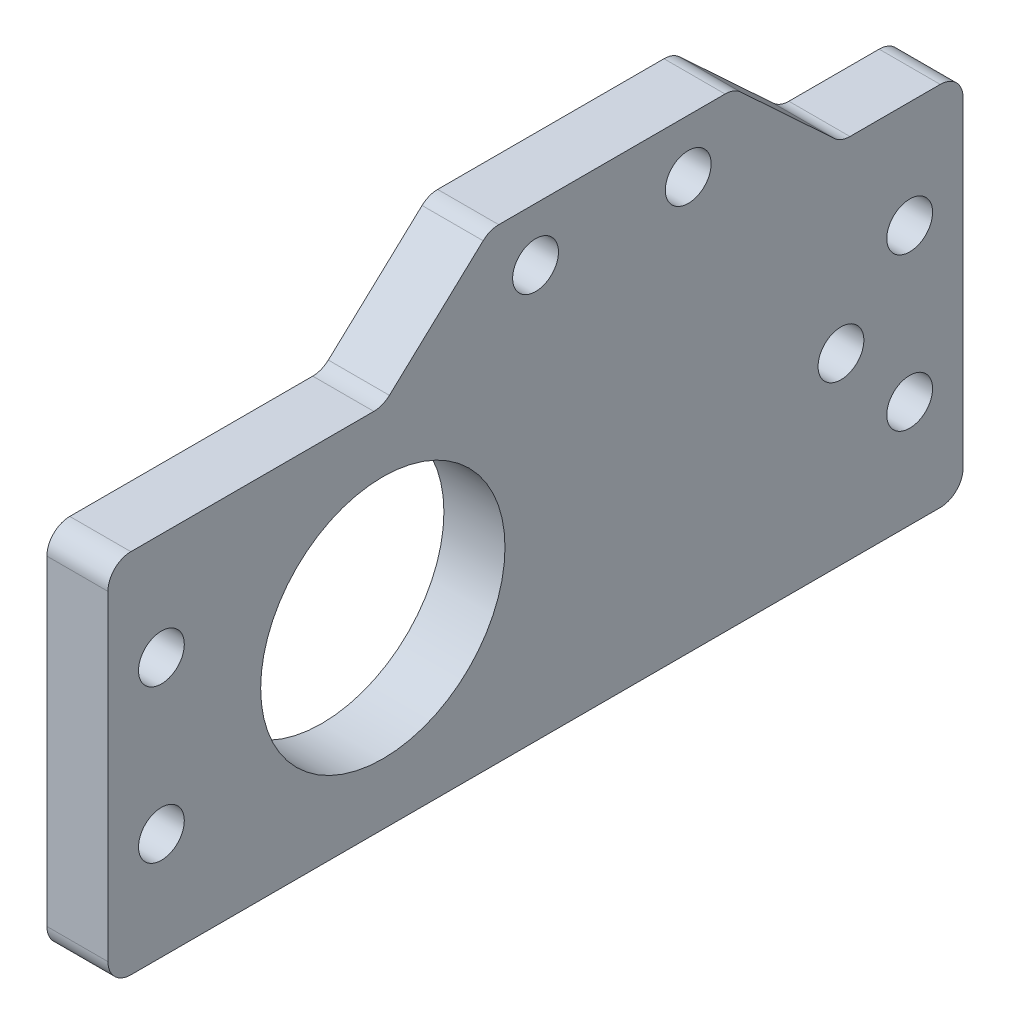
ISO-10303-21;
HEADER;
FILE_DESCRIPTION(('STEP AP214'),'2;1');
FILE_NAME('part.step','',(''),(''),'','','');
FILE_SCHEMA(('AUTOMOTIVE_DESIGN { 1 0 10303 214 1 1 1 1 }'));
ENDSEC;
DATA;
#1=APPLICATION_CONTEXT('core data for automotive mechanical design processes');
#2=APPLICATION_PROTOCOL_DEFINITION('international standard','automotive_design',2000,#1);
#3=PRODUCT_CONTEXT('',#1,'mechanical');
#4=PRODUCT('Part','Part','',(#3));
#5=PRODUCT_RELATED_PRODUCT_CATEGORY('part','',(#4));
#6=PRODUCT_DEFINITION_FORMATION('','',#4);
#7=PRODUCT_DEFINITION_CONTEXT('part definition',#1,'design');
#8=PRODUCT_DEFINITION('design','',#6,#7);
#9=PRODUCT_DEFINITION_SHAPE('','',#8);
#10=(LENGTH_UNIT() NAMED_UNIT(*) SI_UNIT(.MILLI.,.METRE.));
#11=(NAMED_UNIT(*) PLANE_ANGLE_UNIT() SI_UNIT($,.RADIAN.));
#12=(NAMED_UNIT(*) SI_UNIT($,.STERADIAN.) SOLID_ANGLE_UNIT());
#13=UNCERTAINTY_MEASURE_WITH_UNIT(LENGTH_MEASURE(1.E-05),#10,'distance_accuracy_value','');
#14=(GEOMETRIC_REPRESENTATION_CONTEXT(3) GLOBAL_UNCERTAINTY_ASSIGNED_CONTEXT((#13)) GLOBAL_UNIT_ASSIGNED_CONTEXT((#10,
#11,#12)) REPRESENTATION_CONTEXT('',''));
#15=CARTESIAN_POINT('',(0.,0.,0.));
#16=DIRECTION('',(0.,0.,1.));
#17=DIRECTION('',(1.,0.,0.));
#18=AXIS2_PLACEMENT_3D('',#15,#16,#17);
#19=CARTESIAN_POINT('',(4.,13.5,-20.5890353662934));
#20=DIRECTION('',(1.,0.,0.));
#21=DIRECTION('',(0.,0.,-1.));
#22=AXIS2_PLACEMENT_3D('',#19,#20,#21);
#23=PLANE('',#22);
#24=CARTESIAN_POINT('',(4.,-5.,24.5));
#25=DIRECTION('',(1.,0.,0.));
#26=DIRECTION('',(0.,0.,-1.));
#27=AXIS2_PLACEMENT_3D('',#24,#25,#26);
#28=CIRCLE('',#27,1.50000000000001);
#29=CARTESIAN_POINT('',(4.,-5.,23.));
#30=VERTEX_POINT('',#29);
#31=EDGE_CURVE('E363',#30,#30,#28,.T.);
#32=ORIENTED_EDGE('',*,*,#31,.F.);
#33=EDGE_LOOP('',(#32));
#34=FACE_BOUND('',#33,.T.);
#35=CARTESIAN_POINT('',(4.,-5.,-24.5));
#36=DIRECTION('',(1.,0.,0.));
#37=DIRECTION('',(0.,0.,-1.));
#38=AXIS2_PLACEMENT_3D('',#35,#36,#37);
#39=CIRCLE('',#38,1.50000000000001);
#40=CARTESIAN_POINT('',(4.,-5.,-26.));
#41=VERTEX_POINT('',#40);
#42=EDGE_CURVE('E375',#41,#41,#39,.T.);
#43=ORIENTED_EDGE('',*,*,#42,.F.);
#44=EDGE_LOOP('',(#43));
#45=FACE_BOUND('',#44,.T.);
#46=CARTESIAN_POINT('',(4.,0.,10.));
#47=DIRECTION('',(1.,0.,0.));
#48=DIRECTION('',(0.,0.,-1.));
#49=AXIS2_PLACEMENT_3D('',#46,#47,#48);
#50=CIRCLE('',#49,7.99999999999999);
#51=CARTESIAN_POINT('',(4.,0.,2.00000000000001));
#52=VERTEX_POINT('',#51);
#53=EDGE_CURVE('E387',#52,#52,#50,.T.);
#54=ORIENTED_EDGE('',*,*,#53,.F.);
#55=EDGE_LOOP('',(#54));
#56=FACE_BOUND('',#55,.T.);
#57=CARTESIAN_POINT('',(4.,15.,0.));
#58=DIRECTION('',(1.,0.,0.));
#59=DIRECTION('',(0.,0.,-1.));
#60=AXIS2_PLACEMENT_3D('',#57,#58,#59);
#61=CIRCLE('',#60,1.5);
#62=CARTESIAN_POINT('',(4.,15.,-1.5));
#63=VERTEX_POINT('',#62);
#64=EDGE_CURVE('E186',#63,#63,#61,.T.);
#65=ORIENTED_EDGE('',*,*,#64,.F.);
#66=EDGE_LOOP('',(#65));
#67=FACE_BOUND('',#66,.T.);
#68=CARTESIAN_POINT('',(4.,13.5,-20.5890353662934));
#69=DIRECTION('',(-1.,0.,0.));
#70=DIRECTION('',(0.,0.,-1.));
#71=AXIS2_PLACEMENT_3D('',#68,#69,#70);
#72=CIRCLE('',#71,1.50000000000002);
#73=CARTESIAN_POINT('',(4.,12.,-20.5890353663));
#74=VERTEX_POINT('',#73);
#75=CARTESIAN_POINT('',(4.,12.4008097626,-19.5683587172));
#76=VERTEX_POINT('',#75);
#77=EDGE_CURVE('E213',#74,#76,#72,.T.);
#78=ORIENTED_EDGE('',*,*,#77,.T.);
#79=DIRECTION('',(0.,0.680451099367278,0.732793491626299));
#80=VECTOR('',#79,1.);
#81=CARTESIAN_POINT('',(4.,18.0991902374,-13.4316412828));
#82=LINE('',#81,#80);
#83=CARTESIAN_POINT('',(4.,18.0991902374,-13.4316412828));
#84=VERTEX_POINT('',#83);
#85=EDGE_CURVE('E121',#76,#84,#82,.T.);
#86=ORIENTED_EDGE('',*,*,#85,.T.);
#87=CARTESIAN_POINT('',(4.,17.,-12.4109646337066));
#88=DIRECTION('',(1.,0.,0.));
#89=DIRECTION('',(0.,0.,-1.));
#90=AXIS2_PLACEMENT_3D('',#87,#88,#89);
#91=CIRCLE('',#90,1.50000000000001);
#92=CARTESIAN_POINT('',(4.,18.5,-12.4109646337));
#93=VERTEX_POINT('',#92);
#94=EDGE_CURVE('E252',#84,#93,#91,.T.);
#95=ORIENTED_EDGE('',*,*,#94,.T.);
#96=DIRECTION('',(0.,0.,1.));
#97=VECTOR('',#96,1.);
#98=CARTESIAN_POINT('',(4.,18.5,2.4109646337));
#99=LINE('',#98,#97);
#100=CARTESIAN_POINT('',(4.,18.5,2.4109646337));
#101=VERTEX_POINT('',#100);
#102=EDGE_CURVE('E271',#93,#101,#99,.T.);
#103=ORIENTED_EDGE('',*,*,#102,.T.);
#104=CARTESIAN_POINT('',(4.,17.,2.4109646337066));
#105=DIRECTION('',(1.,0.,0.));
#106=DIRECTION('',(0.,0.,-1.));
#107=AXIS2_PLACEMENT_3D('',#104,#105,#106);
#108=CIRCLE('',#107,1.5);
#109=CARTESIAN_POINT('',(4.,18.0991902374,3.4316412828));
#110=VERTEX_POINT('',#109);
#111=EDGE_CURVE('E268',#101,#110,#108,.T.);
#112=ORIENTED_EDGE('',*,*,#111,.T.);
#113=DIRECTION('',(0.,-0.680451099367278,0.732793491626299));
#114=VECTOR('',#113,1.);
#115=CARTESIAN_POINT('',(4.,18.0991902374,3.4316412828));
#116=LINE('',#115,#114);
#117=CARTESIAN_POINT('',(4.,12.4008097626,9.5683587172));
#118=VERTEX_POINT('',#117);
#119=EDGE_CURVE('E270',#110,#118,#116,.T.);
#120=ORIENTED_EDGE('',*,*,#119,.T.);
#121=CARTESIAN_POINT('',(4.,13.5,10.5890353662934));
#122=DIRECTION('',(-1.,0.,0.));
#123=DIRECTION('',(0.,0.,-1.));
#124=AXIS2_PLACEMENT_3D('',#121,#122,#123);
#125=CIRCLE('',#124,1.5);
#126=CARTESIAN_POINT('',(4.,12.,10.5890353663));
#127=VERTEX_POINT('',#126);
#128=EDGE_CURVE('E273',#118,#127,#125,.T.);
#129=ORIENTED_EDGE('',*,*,#128,.T.);
#130=DIRECTION('',(0.,0.,1.));
#131=VECTOR('',#130,1.);
#132=CARTESIAN_POINT('',(4.,12.,26.5));
#133=LINE('',#132,#131);
#134=CARTESIAN_POINT('',(4.,12.,26.5));
#135=VERTEX_POINT('',#134);
#136=EDGE_CURVE('E279',#127,#135,#133,.T.);
#137=ORIENTED_EDGE('',*,*,#136,.T.);
#138=CARTESIAN_POINT('',(4.,10.5,26.5));
#139=DIRECTION('',(1.,0.,0.));
#140=DIRECTION('',(0.,0.,-1.));
#141=AXIS2_PLACEMENT_3D('',#138,#139,#140);
#142=CIRCLE('',#141,1.5);
#143=CARTESIAN_POINT('',(4.,10.5,28.));
#144=VERTEX_POINT('',#143);
#145=EDGE_CURVE('E281',#135,#144,#142,.T.);
#146=ORIENTED_EDGE('',*,*,#145,.T.);
#147=DIRECTION('',(0.,-1.,0.));
#148=VECTOR('',#147,1.);
#149=CARTESIAN_POINT('',(4.,-10.5,28.));
#150=LINE('',#149,#148);
#151=CARTESIAN_POINT('',(4.,-10.5,28.));
#152=VERTEX_POINT('',#151);
#153=EDGE_CURVE('E283',#144,#152,#150,.T.);
#154=ORIENTED_EDGE('',*,*,#153,.T.);
#155=CARTESIAN_POINT('',(4.,-10.5,26.5));
#156=DIRECTION('',(1.,0.,0.));
#157=DIRECTION('',(0.,0.,-1.));
#158=AXIS2_PLACEMENT_3D('',#155,#156,#157);
#159=CIRCLE('',#158,1.5);
#160=CARTESIAN_POINT('',(4.,-12.,26.5));
#161=VERTEX_POINT('',#160);
#162=EDGE_CURVE('E285',#152,#161,#159,.T.);
#163=ORIENTED_EDGE('',*,*,#162,.T.);
#164=DIRECTION('',(0.,0.,-1.));
#165=VECTOR('',#164,1.);
#166=CARTESIAN_POINT('',(4.,-12.,26.5));
#167=LINE('',#166,#165);
#168=CARTESIAN_POINT('',(4.,-12.,-26.5));
#169=VERTEX_POINT('',#168);
#170=EDGE_CURVE('E287',#161,#169,#167,.T.);
#171=ORIENTED_EDGE('',*,*,#170,.T.);
#172=CARTESIAN_POINT('',(4.,-10.5,-26.5));
#173=DIRECTION('',(1.,0.,0.));
#174=DIRECTION('',(0.,0.,-1.));
#175=AXIS2_PLACEMENT_3D('',#172,#173,#174);
#176=CIRCLE('',#175,1.50000000000001);
#177=CARTESIAN_POINT('',(4.,-10.5,-28.));
#178=VERTEX_POINT('',#177);
#179=EDGE_CURVE('E164',#169,#178,#176,.T.);
#180=ORIENTED_EDGE('',*,*,#179,.T.);
#181=DIRECTION('',(0.,1.,0.));
#182=VECTOR('',#181,1.);
#183=CARTESIAN_POINT('',(4.,-10.5,-28.));
#184=LINE('',#183,#182);
#185=CARTESIAN_POINT('',(4.,10.5,-28.));
#186=VERTEX_POINT('',#185);
#187=EDGE_CURVE('E158',#178,#186,#184,.T.);
#188=ORIENTED_EDGE('',*,*,#187,.T.);
#189=CARTESIAN_POINT('',(4.,10.5,-26.5));
#190=DIRECTION('',(1.,0.,0.));
#191=DIRECTION('',(0.,0.,-1.));
#192=AXIS2_PLACEMENT_3D('',#189,#190,#191);
#193=CIRCLE('',#192,1.5);
#194=CARTESIAN_POINT('',(4.,12.,-26.5));
#195=VERTEX_POINT('',#194);
#196=EDGE_CURVE('E162',#186,#195,#193,.T.);
#197=ORIENTED_EDGE('',*,*,#196,.T.);
#198=DIRECTION('',(0.,0.,1.));
#199=VECTOR('',#198,1.);
#200=CARTESIAN_POINT('',(4.,12.,-20.5890353663));
#201=LINE('',#200,#199);
#202=EDGE_CURVE('E54',#195,#74,#201,.T.);
#203=ORIENTED_EDGE('',*,*,#202,.T.);
#204=EDGE_LOOP('',(#78,#86,#95,#103,#112,#120,#129,#137,#146,#154,#163,#171,#180,#188,#197,#203));
#205=FACE_BOUND('',#204,.T.);
#206=CARTESIAN_POINT('',(4.,0.,-20.));
#207=DIRECTION('',(1.,0.,0.));
#208=DIRECTION('',(0.,0.,-1.));
#209=AXIS2_PLACEMENT_3D('',#206,#207,#208);
#210=CIRCLE('',#209,1.50000000000001);
#211=CARTESIAN_POINT('',(4.,0.,-21.5));
#212=VERTEX_POINT('',#211);
#213=EDGE_CURVE('E393',#212,#212,#210,.T.);
#214=ORIENTED_EDGE('',*,*,#213,.F.);
#215=EDGE_LOOP('',(#214));
#216=FACE_BOUND('',#215,.T.);
#217=CARTESIAN_POINT('',(4.,5.,-24.5));
#218=DIRECTION('',(1.,0.,0.));
#219=DIRECTION('',(0.,0.,-1.));
#220=AXIS2_PLACEMENT_3D('',#217,#218,#219);
#221=CIRCLE('',#220,1.50000000000001);
#222=CARTESIAN_POINT('',(4.,5.,-26.));
#223=VERTEX_POINT('',#222);
#224=EDGE_CURVE('E381',#223,#223,#221,.T.);
#225=ORIENTED_EDGE('',*,*,#224,.F.);
#226=EDGE_LOOP('',(#225));
#227=FACE_BOUND('',#226,.T.);
#228=CARTESIAN_POINT('',(4.,5.,24.5));
#229=DIRECTION('',(1.,0.,0.));
#230=DIRECTION('',(0.,0.,-1.));
#231=AXIS2_PLACEMENT_3D('',#228,#229,#230);
#232=CIRCLE('',#231,1.50000000000001);
#233=CARTESIAN_POINT('',(4.,5.,23.));
#234=VERTEX_POINT('',#233);
#235=EDGE_CURVE('E369',#234,#234,#232,.T.);
#236=ORIENTED_EDGE('',*,*,#235,.F.);
#237=EDGE_LOOP('',(#236));
#238=FACE_BOUND('',#237,.T.);
#239=CARTESIAN_POINT('',(4.,15.,-10.));
#240=DIRECTION('',(1.,0.,0.));
#241=DIRECTION('',(0.,0.,-1.));
#242=AXIS2_PLACEMENT_3D('',#239,#240,#241);
#243=CIRCLE('',#242,1.5);
#244=CARTESIAN_POINT('',(4.,15.,-11.5));
#245=VERTEX_POINT('',#244);
#246=EDGE_CURVE('E354',#245,#245,#243,.T.);
#247=ORIENTED_EDGE('',*,*,#246,.F.);
#248=EDGE_LOOP('',(#247));
#249=FACE_BOUND('',#248,.T.);
#250=ADVANCED_FACE('F37',(#34,#45,#56,#67,#205,#216,#227,#238,#249),#23,.T.);
#251=CARTESIAN_POINT('',(0.,13.5,-20.5890353662934));
#252=DIRECTION('',(1.,0.,0.));
#253=DIRECTION('',(0.,0.,-1.));
#254=AXIS2_PLACEMENT_3D('',#251,#252,#253);
#255=PLANE('',#254);
#256=CARTESIAN_POINT('',(0.,13.5,-20.5890353662934));
#257=DIRECTION('',(-1.,0.,0.));
#258=DIRECTION('',(0.,0.,-1.));
#259=AXIS2_PLACEMENT_3D('',#256,#257,#258);
#260=CIRCLE('',#259,1.50000000000002);
#261=CARTESIAN_POINT('',(0.,12.,-20.5890353663));
#262=VERTEX_POINT('',#261);
#263=CARTESIAN_POINT('',(0.,12.4008097626,-19.5683587172));
#264=VERTEX_POINT('',#263);
#265=EDGE_CURVE('E182',#262,#264,#260,.T.);
#266=ORIENTED_EDGE('',*,*,#265,.F.);
#267=DIRECTION('',(0.,0.,1.));
#268=VECTOR('',#267,1.);
#269=CARTESIAN_POINT('',(0.,12.,-20.5890353663));
#270=LINE('',#269,#268);
#271=CARTESIAN_POINT('',(0.,12.,-26.5));
#272=VERTEX_POINT('',#271);
#273=EDGE_CURVE('E113',#272,#262,#270,.T.);
#274=ORIENTED_EDGE('',*,*,#273,.F.);
#275=CARTESIAN_POINT('',(0.,10.5,-26.5));
#276=DIRECTION('',(1.,0.,0.));
#277=DIRECTION('',(0.,0.,-1.));
#278=AXIS2_PLACEMENT_3D('',#275,#276,#277);
#279=CIRCLE('',#278,1.5);
#280=CARTESIAN_POINT('',(0.,10.5,-28.));
#281=VERTEX_POINT('',#280);
#282=EDGE_CURVE('E107',#281,#272,#279,.T.);
#283=ORIENTED_EDGE('',*,*,#282,.F.);
#284=DIRECTION('',(0.,1.,0.));
#285=VECTOR('',#284,1.);
#286=CARTESIAN_POINT('',(0.,-10.5,-28.));
#287=LINE('',#286,#285);
#288=CARTESIAN_POINT('',(0.,-10.5,-28.));
#289=VERTEX_POINT('',#288);
#290=EDGE_CURVE('E172',#289,#281,#287,.T.);
#291=ORIENTED_EDGE('',*,*,#290,.F.);
#292=CARTESIAN_POINT('',(0.,-10.5,-26.5));
#293=DIRECTION('',(1.,0.,0.));
#294=DIRECTION('',(0.,0.,-1.));
#295=AXIS2_PLACEMENT_3D('',#292,#293,#294);
#296=CIRCLE('',#295,1.50000000000001);
#297=CARTESIAN_POINT('',(0.,-12.,-26.5));
#298=VERTEX_POINT('',#297);
#299=EDGE_CURVE('E208',#298,#289,#296,.T.);
#300=ORIENTED_EDGE('',*,*,#299,.F.);
#301=DIRECTION('',(0.,0.,-1.));
#302=VECTOR('',#301,1.);
#303=CARTESIAN_POINT('',(0.,-12.,26.5));
#304=LINE('',#303,#302);
#305=CARTESIAN_POINT('',(0.,-12.,26.5));
#306=VERTEX_POINT('',#305);
#307=EDGE_CURVE('E206',#306,#298,#304,.T.);
#308=ORIENTED_EDGE('',*,*,#307,.F.);
#309=CARTESIAN_POINT('',(0.,-10.5,26.5));
#310=DIRECTION('',(1.,0.,0.));
#311=DIRECTION('',(0.,0.,-1.));
#312=AXIS2_PLACEMENT_3D('',#309,#310,#311);
#313=CIRCLE('',#312,1.5);
#314=CARTESIAN_POINT('',(0.,-10.5,28.));
#315=VERTEX_POINT('',#314);
#316=EDGE_CURVE('E204',#315,#306,#313,.T.);
#317=ORIENTED_EDGE('',*,*,#316,.F.);
#318=DIRECTION('',(0.,-1.,0.));
#319=VECTOR('',#318,1.);
#320=CARTESIAN_POINT('',(0.,-10.5,28.));
#321=LINE('',#320,#319);
#322=CARTESIAN_POINT('',(0.,10.5,28.));
#323=VERTEX_POINT('',#322);
#324=EDGE_CURVE('E202',#323,#315,#321,.T.);
#325=ORIENTED_EDGE('',*,*,#324,.F.);
#326=CARTESIAN_POINT('',(0.,10.5,26.5));
#327=DIRECTION('',(1.,0.,0.));
#328=DIRECTION('',(0.,0.,-1.));
#329=AXIS2_PLACEMENT_3D('',#326,#327,#328);
#330=CIRCLE('',#329,1.5);
#331=CARTESIAN_POINT('',(0.,12.,26.5));
#332=VERTEX_POINT('',#331);
#333=EDGE_CURVE('E200',#332,#323,#330,.T.);
#334=ORIENTED_EDGE('',*,*,#333,.F.);
#335=DIRECTION('',(0.,0.,1.));
#336=VECTOR('',#335,1.);
#337=CARTESIAN_POINT('',(0.,12.,26.5));
#338=LINE('',#337,#336);
#339=CARTESIAN_POINT('',(0.,12.,10.5890353663));
#340=VERTEX_POINT('',#339);
#341=EDGE_CURVE('E198',#340,#332,#338,.T.);
#342=ORIENTED_EDGE('',*,*,#341,.F.);
#343=CARTESIAN_POINT('',(0.,13.5,10.5890353662934));
#344=DIRECTION('',(-1.,0.,0.));
#345=DIRECTION('',(0.,0.,-1.));
#346=AXIS2_PLACEMENT_3D('',#343,#344,#345);
#347=CIRCLE('',#346,1.5);
#348=CARTESIAN_POINT('',(0.,12.4008097626,9.5683587172));
#349=VERTEX_POINT('',#348);
#350=EDGE_CURVE('E196',#349,#340,#347,.T.);
#351=ORIENTED_EDGE('',*,*,#350,.F.);
#352=DIRECTION('',(0.,-0.680451099367278,0.732793491626299));
#353=VECTOR('',#352,1.);
#354=CARTESIAN_POINT('',(0.,18.0991902374,3.4316412828));
#355=LINE('',#354,#353);
#356=CARTESIAN_POINT('',(0.,18.0991902374,3.4316412828));
#357=VERTEX_POINT('',#356);
#358=EDGE_CURVE('E194',#357,#349,#355,.T.);
#359=ORIENTED_EDGE('',*,*,#358,.F.);
#360=CARTESIAN_POINT('',(0.,17.,2.4109646337066));
#361=DIRECTION('',(1.,0.,0.));
#362=DIRECTION('',(0.,0.,-1.));
#363=AXIS2_PLACEMENT_3D('',#360,#361,#362);
#364=CIRCLE('',#363,1.5);
#365=CARTESIAN_POINT('',(0.,18.5,2.4109646337));
#366=VERTEX_POINT('',#365);
#367=EDGE_CURVE('E192',#366,#357,#364,.T.);
#368=ORIENTED_EDGE('',*,*,#367,.F.);
#369=DIRECTION('',(0.,0.,1.));
#370=VECTOR('',#369,1.);
#371=CARTESIAN_POINT('',(0.,18.5,2.4109646337));
#372=LINE('',#371,#370);
#373=CARTESIAN_POINT('',(0.,18.5,-12.4109646337));
#374=VERTEX_POINT('',#373);
#375=EDGE_CURVE('E190',#374,#366,#372,.T.);
#376=ORIENTED_EDGE('',*,*,#375,.F.);
#377=CARTESIAN_POINT('',(0.,17.,-12.4109646337066));
#378=DIRECTION('',(1.,0.,0.));
#379=DIRECTION('',(0.,0.,-1.));
#380=AXIS2_PLACEMENT_3D('',#377,#378,#379);
#381=CIRCLE('',#380,1.50000000000001);
#382=CARTESIAN_POINT('',(0.,18.0991902374,-13.4316412828));
#383=VERTEX_POINT('',#382);
#384=EDGE_CURVE('E188',#383,#374,#381,.T.);
#385=ORIENTED_EDGE('',*,*,#384,.F.);
#386=DIRECTION('',(0.,0.680451099367278,0.732793491626299));
#387=VECTOR('',#386,1.);
#388=CARTESIAN_POINT('',(0.,18.0991902374,-13.4316412828));
#389=LINE('',#388,#387);
#390=EDGE_CURVE('E185',#264,#383,#389,.T.);
#391=ORIENTED_EDGE('',*,*,#390,.F.);
#392=EDGE_LOOP('',(#266,#274,#283,#291,#300,#308,#317,#325,#334,#342,#351,#359,#368,#376,#385,#391));
#393=FACE_BOUND('',#392,.T.);
#394=CARTESIAN_POINT('',(0.,15.,0.));
#395=DIRECTION('',(1.,0.,0.));
#396=DIRECTION('',(0.,0.,-1.));
#397=AXIS2_PLACEMENT_3D('',#394,#395,#396);
#398=CIRCLE('',#397,1.5);
#399=CARTESIAN_POINT('',(0.,15.,-1.5));
#400=VERTEX_POINT('',#399);
#401=EDGE_CURVE('E396',#400,#400,#398,.T.);
#402=ORIENTED_EDGE('',*,*,#401,.T.);
#403=EDGE_LOOP('',(#402));
#404=FACE_BOUND('',#403,.T.);
#405=CARTESIAN_POINT('',(0.,0.,-20.));
#406=DIRECTION('',(1.,0.,0.));
#407=DIRECTION('',(0.,0.,-1.));
#408=AXIS2_PLACEMENT_3D('',#405,#406,#407);
#409=CIRCLE('',#408,1.50000000000001);
#410=CARTESIAN_POINT('',(0.,0.,-21.5));
#411=VERTEX_POINT('',#410);
#412=EDGE_CURVE('E390',#411,#411,#409,.T.);
#413=ORIENTED_EDGE('',*,*,#412,.T.);
#414=EDGE_LOOP('',(#413));
#415=FACE_BOUND('',#414,.T.);
#416=CARTESIAN_POINT('',(0.,0.,10.));
#417=DIRECTION('',(1.,0.,0.));
#418=DIRECTION('',(0.,0.,-1.));
#419=AXIS2_PLACEMENT_3D('',#416,#417,#418);
#420=CIRCLE('',#419,7.99999999999999);
#421=CARTESIAN_POINT('',(0.,0.,2.00000000000001));
#422=VERTEX_POINT('',#421);
#423=EDGE_CURVE('E384',#422,#422,#420,.T.);
#424=ORIENTED_EDGE('',*,*,#423,.T.);
#425=EDGE_LOOP('',(#424));
#426=FACE_BOUND('',#425,.T.);
#427=CARTESIAN_POINT('',(0.,5.,-24.5));
#428=DIRECTION('',(1.,0.,0.));
#429=DIRECTION('',(0.,0.,-1.));
#430=AXIS2_PLACEMENT_3D('',#427,#428,#429);
#431=CIRCLE('',#430,1.50000000000001);
#432=CARTESIAN_POINT('',(0.,5.,-26.));
#433=VERTEX_POINT('',#432);
#434=EDGE_CURVE('E378',#433,#433,#431,.T.);
#435=ORIENTED_EDGE('',*,*,#434,.T.);
#436=EDGE_LOOP('',(#435));
#437=FACE_BOUND('',#436,.T.);
#438=CARTESIAN_POINT('',(0.,-5.,-24.5));
#439=DIRECTION('',(1.,0.,0.));
#440=DIRECTION('',(0.,0.,-1.));
#441=AXIS2_PLACEMENT_3D('',#438,#439,#440);
#442=CIRCLE('',#441,1.50000000000001);
#443=CARTESIAN_POINT('',(0.,-5.,-26.));
#444=VERTEX_POINT('',#443);
#445=EDGE_CURVE('E372',#444,#444,#442,.T.);
#446=ORIENTED_EDGE('',*,*,#445,.T.);
#447=EDGE_LOOP('',(#446));
#448=FACE_BOUND('',#447,.T.);
#449=CARTESIAN_POINT('',(0.,5.,24.5));
#450=DIRECTION('',(1.,0.,0.));
#451=DIRECTION('',(0.,0.,-1.));
#452=AXIS2_PLACEMENT_3D('',#449,#450,#451);
#453=CIRCLE('',#452,1.50000000000001);
#454=CARTESIAN_POINT('',(0.,5.,23.));
#455=VERTEX_POINT('',#454);
#456=EDGE_CURVE('E366',#455,#455,#453,.T.);
#457=ORIENTED_EDGE('',*,*,#456,.T.);
#458=EDGE_LOOP('',(#457));
#459=FACE_BOUND('',#458,.T.);
#460=CARTESIAN_POINT('',(0.,-5.,24.5));
#461=DIRECTION('',(1.,0.,0.));
#462=DIRECTION('',(0.,0.,-1.));
#463=AXIS2_PLACEMENT_3D('',#460,#461,#462);
#464=CIRCLE('',#463,1.50000000000001);
#465=CARTESIAN_POINT('',(0.,-5.,23.));
#466=VERTEX_POINT('',#465);
#467=EDGE_CURVE('E360',#466,#466,#464,.T.);
#468=ORIENTED_EDGE('',*,*,#467,.T.);
#469=EDGE_LOOP('',(#468));
#470=FACE_BOUND('',#469,.T.);
#471=CARTESIAN_POINT('',(0.,15.,-10.));
#472=DIRECTION('',(1.,0.,0.));
#473=DIRECTION('',(0.,0.,-1.));
#474=AXIS2_PLACEMENT_3D('',#471,#472,#473);
#475=CIRCLE('',#474,1.5);
#476=CARTESIAN_POINT('',(0.,15.,-11.5));
#477=VERTEX_POINT('',#476);
#478=EDGE_CURVE('E357',#477,#477,#475,.T.);
#479=ORIENTED_EDGE('',*,*,#478,.T.);
#480=EDGE_LOOP('',(#479));
#481=FACE_BOUND('',#480,.T.);
#482=ADVANCED_FACE('F256',(#393,#404,#415,#426,#437,#448,#459,#470,#481),#255,.F.);
#483=CARTESIAN_POINT('',(4.,13.5,-20.5890353662934));
#484=DIRECTION('',(-1.,0.,0.));
#485=DIRECTION('',(0.,0.,1.));
#486=AXIS2_PLACEMENT_3D('',#483,#484,#485);
#487=CYLINDRICAL_SURFACE('',#486,1.50000000000002);
#488=ORIENTED_EDGE('',*,*,#265,.T.);
#489=DIRECTION('',(-1.,0.,0.));
#490=VECTOR('',#489,1.);
#491=CARTESIAN_POINT('',(4.,12.4008097626,-19.5683587172));
#492=LINE('',#491,#490);
#493=EDGE_CURVE('E11',#76,#264,#492,.T.);
#494=ORIENTED_EDGE('',*,*,#493,.F.);
#495=ORIENTED_EDGE('',*,*,#77,.F.);
#496=DIRECTION('',(-1.,0.,0.));
#497=VECTOR('',#496,1.);
#498=CARTESIAN_POINT('',(4.,12.,-20.5890353663));
#499=LINE('',#498,#497);
#500=EDGE_CURVE('E178',#74,#262,#499,.T.);
#501=ORIENTED_EDGE('',*,*,#500,.T.);
#502=EDGE_LOOP('',(#488,#494,#495,#501));
#503=FACE_BOUND('',#502,.T.);
#504=ADVANCED_FACE('F39',(#503),#487,.F.);
#505=CARTESIAN_POINT('',(4.,18.0991902374,-13.4316412828));
#506=DIRECTION('',(0.,-0.732793491626299,0.680451099367278));
#507=DIRECTION('',(0.,-0.680451099367278,-0.732793491626299));
#508=AXIS2_PLACEMENT_3D('',#505,#506,#507);
#509=PLANE('',#508);
#510=ORIENTED_EDGE('',*,*,#390,.T.);
#511=DIRECTION('',(-1.,0.,0.));
#512=VECTOR('',#511,1.);
#513=CARTESIAN_POINT('',(4.,18.0991902374,-13.4316412828));
#514=LINE('',#513,#512);
#515=EDGE_CURVE('E46',#84,#383,#514,.T.);
#516=ORIENTED_EDGE('',*,*,#515,.F.);
#517=ORIENTED_EDGE('',*,*,#85,.F.);
#518=ORIENTED_EDGE('',*,*,#493,.T.);
#519=EDGE_LOOP('',(#510,#516,#517,#518));
#520=FACE_BOUND('',#519,.T.);
#521=ADVANCED_FACE('F596',(#520),#509,.F.);
#522=CARTESIAN_POINT('',(4.,17.,-12.4109646337066));
#523=DIRECTION('',(-1.,0.,0.));
#524=DIRECTION('',(0.,0.,1.));
#525=AXIS2_PLACEMENT_3D('',#522,#523,#524);
#526=CYLINDRICAL_SURFACE('',#525,1.50000000000001);
#527=ORIENTED_EDGE('',*,*,#384,.T.);
#528=DIRECTION('',(-1.,0.,0.));
#529=VECTOR('',#528,1.);
#530=CARTESIAN_POINT('',(4.,18.5,-12.4109646337));
#531=LINE('',#530,#529);
#532=EDGE_CURVE('E244',#93,#374,#531,.T.);
#533=ORIENTED_EDGE('',*,*,#532,.F.);
#534=ORIENTED_EDGE('',*,*,#94,.F.);
#535=ORIENTED_EDGE('',*,*,#515,.T.);
#536=EDGE_LOOP('',(#527,#533,#534,#535));
#537=FACE_BOUND('',#536,.T.);
#538=ADVANCED_FACE('F250',(#537),#526,.T.);
#539=CARTESIAN_POINT('',(4.,18.5,2.4109646337));
#540=DIRECTION('',(0.,-1.,0.));
#541=DIRECTION('',(0.,0.,-1.));
#542=AXIS2_PLACEMENT_3D('',#539,#540,#541);
#543=PLANE('',#542);
#544=ORIENTED_EDGE('',*,*,#375,.T.);
#545=DIRECTION('',(-1.,0.,0.));
#546=VECTOR('',#545,1.);
#547=CARTESIAN_POINT('',(4.,18.5,2.4109646337));
#548=LINE('',#547,#546);
#549=EDGE_CURVE('E241',#101,#366,#548,.T.);
#550=ORIENTED_EDGE('',*,*,#549,.F.);
#551=ORIENTED_EDGE('',*,*,#102,.F.);
#552=ORIENTED_EDGE('',*,*,#532,.T.);
#553=EDGE_LOOP('',(#544,#550,#551,#552));
#554=FACE_BOUND('',#553,.T.);
#555=ADVANCED_FACE('F262',(#554),#543,.F.);
#556=CARTESIAN_POINT('',(4.,17.,2.4109646337066));
#557=DIRECTION('',(-1.,0.,0.));
#558=DIRECTION('',(0.,0.,1.));
#559=AXIS2_PLACEMENT_3D('',#556,#557,#558);
#560=CYLINDRICAL_SURFACE('',#559,1.5);
#561=ORIENTED_EDGE('',*,*,#367,.T.);
#562=DIRECTION('',(-1.,0.,0.));
#563=VECTOR('',#562,1.);
#564=CARTESIAN_POINT('',(4.,18.0991902374,3.4316412828));
#565=LINE('',#564,#563);
#566=EDGE_CURVE('E238',#110,#357,#565,.T.);
#567=ORIENTED_EDGE('',*,*,#566,.F.);
#568=ORIENTED_EDGE('',*,*,#111,.F.);
#569=ORIENTED_EDGE('',*,*,#549,.T.);
#570=EDGE_LOOP('',(#561,#567,#568,#569));
#571=FACE_BOUND('',#570,.T.);
#572=ADVANCED_FACE('F266',(#571),#560,.T.);
#573=CARTESIAN_POINT('',(4.,18.0991902374,3.4316412828));
#574=DIRECTION('',(0.,-0.732793491626299,-0.680451099367278));
#575=DIRECTION('',(0.,0.680451099367278,-0.732793491626299));
#576=AXIS2_PLACEMENT_3D('',#573,#574,#575);
#577=PLANE('',#576);
#578=ORIENTED_EDGE('',*,*,#358,.T.);
#579=DIRECTION('',(-1.,0.,0.));
#580=VECTOR('',#579,1.);
#581=CARTESIAN_POINT('',(4.,12.4008097626,9.5683587172));
#582=LINE('',#581,#580);
#583=EDGE_CURVE('E235',#118,#349,#582,.T.);
#584=ORIENTED_EDGE('',*,*,#583,.F.);
#585=ORIENTED_EDGE('',*,*,#119,.F.);
#586=ORIENTED_EDGE('',*,*,#566,.T.);
#587=EDGE_LOOP('',(#578,#584,#585,#586));
#588=FACE_BOUND('',#587,.T.);
#589=ADVANCED_FACE('F557',(#588),#577,.F.);
#590=CARTESIAN_POINT('',(4.,13.5,10.5890353662934));
#591=DIRECTION('',(-1.,0.,0.));
#592=DIRECTION('',(0.,0.,1.));
#593=AXIS2_PLACEMENT_3D('',#590,#591,#592);
#594=CYLINDRICAL_SURFACE('',#593,1.5);
#595=ORIENTED_EDGE('',*,*,#350,.T.);
#596=DIRECTION('',(-1.,0.,0.));
#597=VECTOR('',#596,1.);
#598=CARTESIAN_POINT('',(4.,12.,10.5890353663));
#599=LINE('',#598,#597);
#600=EDGE_CURVE('E232',#127,#340,#599,.T.);
#601=ORIENTED_EDGE('',*,*,#600,.F.);
#602=ORIENTED_EDGE('',*,*,#128,.F.);
#603=ORIENTED_EDGE('',*,*,#583,.T.);
#604=EDGE_LOOP('',(#595,#601,#602,#603));
#605=FACE_BOUND('',#604,.T.);
#606=ADVANCED_FACE('F546',(#605),#594,.F.);
#607=CARTESIAN_POINT('',(4.,12.,26.5));
#608=DIRECTION('',(0.,-1.,0.));
#609=DIRECTION('',(0.,0.,-1.));
#610=AXIS2_PLACEMENT_3D('',#607,#608,#609);
#611=PLANE('',#610);
#612=ORIENTED_EDGE('',*,*,#341,.T.);
#613=DIRECTION('',(-1.,0.,0.));
#614=VECTOR('',#613,1.);
#615=CARTESIAN_POINT('',(4.,12.,26.5));
#616=LINE('',#615,#614);
#617=EDGE_CURVE('E229',#135,#332,#616,.T.);
#618=ORIENTED_EDGE('',*,*,#617,.F.);
#619=ORIENTED_EDGE('',*,*,#136,.F.);
#620=ORIENTED_EDGE('',*,*,#600,.T.);
#621=EDGE_LOOP('',(#612,#618,#619,#620));
#622=FACE_BOUND('',#621,.T.);
#623=ADVANCED_FACE('F535',(#622),#611,.F.);
#624=CARTESIAN_POINT('',(4.,10.5,26.5));
#625=DIRECTION('',(-1.,0.,0.));
#626=DIRECTION('',(0.,0.,1.));
#627=AXIS2_PLACEMENT_3D('',#624,#625,#626);
#628=CYLINDRICAL_SURFACE('',#627,1.5);
#629=ORIENTED_EDGE('',*,*,#333,.T.);
#630=DIRECTION('',(-1.,0.,0.));
#631=VECTOR('',#630,1.);
#632=CARTESIAN_POINT('',(4.,10.5,28.));
#633=LINE('',#632,#631);
#634=EDGE_CURVE('E226',#144,#323,#633,.T.);
#635=ORIENTED_EDGE('',*,*,#634,.F.);
#636=ORIENTED_EDGE('',*,*,#145,.F.);
#637=ORIENTED_EDGE('',*,*,#617,.T.);
#638=EDGE_LOOP('',(#629,#635,#636,#637));
#639=FACE_BOUND('',#638,.T.);
#640=ADVANCED_FACE('F524',(#639),#628,.T.);
#641=CARTESIAN_POINT('',(4.,-10.5,28.));
#642=DIRECTION('',(0.,0.,-1.));
#643=DIRECTION('',(-1.,0.,0.));
#644=AXIS2_PLACEMENT_3D('',#641,#642,#643);
#645=PLANE('',#644);
#646=ORIENTED_EDGE('',*,*,#324,.T.);
#647=DIRECTION('',(-1.,0.,0.));
#648=VECTOR('',#647,1.);
#649=CARTESIAN_POINT('',(4.,-10.5,28.));
#650=LINE('',#649,#648);
#651=EDGE_CURVE('E223',#152,#315,#650,.T.);
#652=ORIENTED_EDGE('',*,*,#651,.F.);
#653=ORIENTED_EDGE('',*,*,#153,.F.);
#654=ORIENTED_EDGE('',*,*,#634,.T.);
#655=EDGE_LOOP('',(#646,#652,#653,#654));
#656=FACE_BOUND('',#655,.T.);
#657=ADVANCED_FACE('F513',(#656),#645,.F.);
#658=CARTESIAN_POINT('',(4.,-10.5,26.5));
#659=DIRECTION('',(-1.,0.,0.));
#660=DIRECTION('',(0.,0.,1.));
#661=AXIS2_PLACEMENT_3D('',#658,#659,#660);
#662=CYLINDRICAL_SURFACE('',#661,1.5);
#663=ORIENTED_EDGE('',*,*,#316,.T.);
#664=DIRECTION('',(-1.,0.,0.));
#665=VECTOR('',#664,1.);
#666=CARTESIAN_POINT('',(4.,-12.,26.5));
#667=LINE('',#666,#665);
#668=EDGE_CURVE('E220',#161,#306,#667,.T.);
#669=ORIENTED_EDGE('',*,*,#668,.F.);
#670=ORIENTED_EDGE('',*,*,#162,.F.);
#671=ORIENTED_EDGE('',*,*,#651,.T.);
#672=EDGE_LOOP('',(#663,#669,#670,#671));
#673=FACE_BOUND('',#672,.T.);
#674=ADVANCED_FACE('F503',(#673),#662,.T.);
#675=CARTESIAN_POINT('',(4.,-12.,26.5));
#676=DIRECTION('',(0.,1.,0.));
#677=DIRECTION('',(0.,0.,1.));
#678=AXIS2_PLACEMENT_3D('',#675,#676,#677);
#679=PLANE('',#678);
#680=ORIENTED_EDGE('',*,*,#307,.T.);
#681=DIRECTION('',(-1.,0.,0.));
#682=VECTOR('',#681,1.);
#683=CARTESIAN_POINT('',(4.,-12.,-26.5));
#684=LINE('',#683,#682);
#685=EDGE_CURVE('E217',#169,#298,#684,.T.);
#686=ORIENTED_EDGE('',*,*,#685,.F.);
#687=ORIENTED_EDGE('',*,*,#170,.F.);
#688=ORIENTED_EDGE('',*,*,#668,.T.);
#689=EDGE_LOOP('',(#680,#686,#687,#688));
#690=FACE_BOUND('',#689,.T.);
#691=ADVANCED_FACE('F293',(#690),#679,.F.);
#692=CARTESIAN_POINT('',(4.,-10.5,-26.5));
#693=DIRECTION('',(-1.,0.,0.));
#694=DIRECTION('',(0.,0.,1.));
#695=AXIS2_PLACEMENT_3D('',#692,#693,#694);
#696=CYLINDRICAL_SURFACE('',#695,1.50000000000001);
#697=ORIENTED_EDGE('',*,*,#299,.T.);
#698=DIRECTION('',(-1.,0.,0.));
#699=VECTOR('',#698,1.);
#700=CARTESIAN_POINT('',(4.,-10.5,-28.));
#701=LINE('',#700,#699);
#702=EDGE_CURVE('E173',#178,#289,#701,.T.);
#703=ORIENTED_EDGE('',*,*,#702,.F.);
#704=ORIENTED_EDGE('',*,*,#179,.F.);
#705=ORIENTED_EDGE('',*,*,#685,.T.);
#706=EDGE_LOOP('',(#697,#703,#704,#705));
#707=FACE_BOUND('',#706,.T.);
#708=ADVANCED_FACE('F297',(#707),#696,.T.);
#709=CARTESIAN_POINT('',(4.,-10.5,-28.));
#710=DIRECTION('',(0.,0.,1.));
#711=DIRECTION('',(0.,-1.,0.));
#712=AXIS2_PLACEMENT_3D('',#709,#710,#711);
#713=PLANE('',#712);
#714=ORIENTED_EDGE('',*,*,#290,.T.);
#715=DIRECTION('',(-1.,0.,0.));
#716=VECTOR('',#715,1.);
#717=CARTESIAN_POINT('',(4.,10.5,-28.));
#718=LINE('',#717,#716);
#719=EDGE_CURVE('E169',#186,#281,#718,.T.);
#720=ORIENTED_EDGE('',*,*,#719,.F.);
#721=ORIENTED_EDGE('',*,*,#187,.F.);
#722=ORIENTED_EDGE('',*,*,#702,.T.);
#723=EDGE_LOOP('',(#714,#720,#721,#722));
#724=FACE_BOUND('',#723,.T.);
#725=ADVANCED_FACE('F170',(#724),#713,.F.);
#726=CARTESIAN_POINT('',(4.,10.5,-26.5));
#727=DIRECTION('',(-1.,0.,0.));
#728=DIRECTION('',(0.,0.,1.));
#729=AXIS2_PLACEMENT_3D('',#726,#727,#728);
#730=CYLINDRICAL_SURFACE('',#729,1.5);
#731=ORIENTED_EDGE('',*,*,#282,.T.);
#732=DIRECTION('',(-1.,0.,0.));
#733=VECTOR('',#732,1.);
#734=CARTESIAN_POINT('',(4.,12.,-26.5));
#735=LINE('',#734,#733);
#736=EDGE_CURVE('E174',#195,#272,#735,.T.);
#737=ORIENTED_EDGE('',*,*,#736,.F.);
#738=ORIENTED_EDGE('',*,*,#196,.F.);
#739=ORIENTED_EDGE('',*,*,#719,.T.);
#740=EDGE_LOOP('',(#731,#737,#738,#739));
#741=FACE_BOUND('',#740,.T.);
#742=ADVANCED_FACE('F176',(#741),#730,.T.);
#743=CARTESIAN_POINT('',(4.,12.,-20.5890353663));
#744=DIRECTION('',(0.,-1.,0.));
#745=DIRECTION('',(0.,0.,-1.));
#746=AXIS2_PLACEMENT_3D('',#743,#744,#745);
#747=PLANE('',#746);
#748=ORIENTED_EDGE('',*,*,#273,.T.);
#749=ORIENTED_EDGE('',*,*,#500,.F.);
#750=ORIENTED_EDGE('',*,*,#202,.F.);
#751=ORIENTED_EDGE('',*,*,#736,.T.);
#752=EDGE_LOOP('',(#748,#749,#750,#751));
#753=FACE_BOUND('',#752,.T.);
#754=ADVANCED_FACE('F301',(#753),#747,.F.);
#755=CARTESIAN_POINT('',(4.,15.,0.));
#756=DIRECTION('',(-1.,0.,0.));
#757=DIRECTION('',(0.,0.,1.));
#758=AXIS2_PLACEMENT_3D('',#755,#756,#757);
#759=CYLINDRICAL_SURFACE('',#758,1.5);
#760=ORIENTED_EDGE('',*,*,#64,.T.);
#761=EDGE_LOOP('',(#760));
#762=FACE_BOUND('',#761,.T.);
#763=ORIENTED_EDGE('',*,*,#401,.F.);
#764=EDGE_LOOP('',(#763));
#765=FACE_BOUND('',#764,.T.);
#766=ADVANCED_FACE('F303',(#762,#765),#759,.F.);
#767=CARTESIAN_POINT('',(4.,0.,-20.));
#768=DIRECTION('',(-1.,0.,0.));
#769=DIRECTION('',(0.,0.,1.));
#770=AXIS2_PLACEMENT_3D('',#767,#768,#769);
#771=CYLINDRICAL_SURFACE('',#770,1.50000000000001);
#772=ORIENTED_EDGE('',*,*,#213,.T.);
#773=EDGE_LOOP('',(#772));
#774=FACE_BOUND('',#773,.T.);
#775=ORIENTED_EDGE('',*,*,#412,.F.);
#776=EDGE_LOOP('',(#775));
#777=FACE_BOUND('',#776,.T.);
#778=ADVANCED_FACE('F309',(#774,#777),#771,.F.);
#779=CARTESIAN_POINT('',(4.,0.,10.));
#780=DIRECTION('',(-1.,0.,0.));
#781=DIRECTION('',(0.,0.,1.));
#782=AXIS2_PLACEMENT_3D('',#779,#780,#781);
#783=CYLINDRICAL_SURFACE('',#782,7.99999999999999);
#784=ORIENTED_EDGE('',*,*,#53,.T.);
#785=EDGE_LOOP('',(#784));
#786=FACE_BOUND('',#785,.T.);
#787=ORIENTED_EDGE('',*,*,#423,.F.);
#788=EDGE_LOOP('',(#787));
#789=FACE_BOUND('',#788,.T.);
#790=ADVANCED_FACE('F325',(#786,#789),#783,.F.);
#791=CARTESIAN_POINT('',(4.,5.,-24.5));
#792=DIRECTION('',(-1.,0.,0.));
#793=DIRECTION('',(0.,0.,1.));
#794=AXIS2_PLACEMENT_3D('',#791,#792,#793);
#795=CYLINDRICAL_SURFACE('',#794,1.50000000000001);
#796=ORIENTED_EDGE('',*,*,#224,.T.);
#797=EDGE_LOOP('',(#796));
#798=FACE_BOUND('',#797,.T.);
#799=ORIENTED_EDGE('',*,*,#434,.F.);
#800=EDGE_LOOP('',(#799));
#801=FACE_BOUND('',#800,.T.);
#802=ADVANCED_FACE('F329',(#798,#801),#795,.F.);
#803=CARTESIAN_POINT('',(4.,-5.,-24.5));
#804=DIRECTION('',(-1.,0.,0.));
#805=DIRECTION('',(0.,0.,1.));
#806=AXIS2_PLACEMENT_3D('',#803,#804,#805);
#807=CYLINDRICAL_SURFACE('',#806,1.50000000000001);
#808=ORIENTED_EDGE('',*,*,#42,.T.);
#809=EDGE_LOOP('',(#808));
#810=FACE_BOUND('',#809,.T.);
#811=ORIENTED_EDGE('',*,*,#445,.F.);
#812=EDGE_LOOP('',(#811));
#813=FACE_BOUND('',#812,.T.);
#814=ADVANCED_FACE('F333',(#810,#813),#807,.F.);
#815=CARTESIAN_POINT('',(4.,5.,24.5));
#816=DIRECTION('',(-1.,0.,0.));
#817=DIRECTION('',(0.,0.,1.));
#818=AXIS2_PLACEMENT_3D('',#815,#816,#817);
#819=CYLINDRICAL_SURFACE('',#818,1.50000000000001);
#820=ORIENTED_EDGE('',*,*,#235,.T.);
#821=EDGE_LOOP('',(#820));
#822=FACE_BOUND('',#821,.T.);
#823=ORIENTED_EDGE('',*,*,#456,.F.);
#824=EDGE_LOOP('',(#823));
#825=FACE_BOUND('',#824,.T.);
#826=ADVANCED_FACE('F337',(#822,#825),#819,.F.);
#827=CARTESIAN_POINT('',(4.,-5.,24.5));
#828=DIRECTION('',(-1.,0.,0.));
#829=DIRECTION('',(0.,0.,1.));
#830=AXIS2_PLACEMENT_3D('',#827,#828,#829);
#831=CYLINDRICAL_SURFACE('',#830,1.50000000000001);
#832=ORIENTED_EDGE('',*,*,#31,.T.);
#833=EDGE_LOOP('',(#832));
#834=FACE_BOUND('',#833,.T.);
#835=ORIENTED_EDGE('',*,*,#467,.F.);
#836=EDGE_LOOP('',(#835));
#837=FACE_BOUND('',#836,.T.);
#838=ADVANCED_FACE('F341',(#834,#837),#831,.F.);
#839=CARTESIAN_POINT('',(4.,15.,-10.));
#840=DIRECTION('',(-1.,0.,0.));
#841=DIRECTION('',(0.,0.,1.));
#842=AXIS2_PLACEMENT_3D('',#839,#840,#841);
#843=CYLINDRICAL_SURFACE('',#842,1.5);
#844=ORIENTED_EDGE('',*,*,#246,.T.);
#845=EDGE_LOOP('',(#844));
#846=FACE_BOUND('',#845,.T.);
#847=ORIENTED_EDGE('',*,*,#478,.F.);
#848=EDGE_LOOP('',(#847));
#849=FACE_BOUND('',#848,.T.);
#850=ADVANCED_FACE('F345',(#846,#849),#843,.F.);
#851=CLOSED_SHELL('',(#250,#482,#504,#521,#538,#555,#572,#589,#606,#623,#640,#657,#674,#691,
#708,#725,#742,#754,#766,#778,#790,#802,#814,#826,#838,#850));
#852=MANIFOLD_SOLID_BREP('B2',#851);
#853=ADVANCED_BREP_SHAPE_REPRESENTATION('',(#18,#852),#14);
#854=SHAPE_DEFINITION_REPRESENTATION(#9,#853);
ENDSEC;
END-ISO-10303-21;
